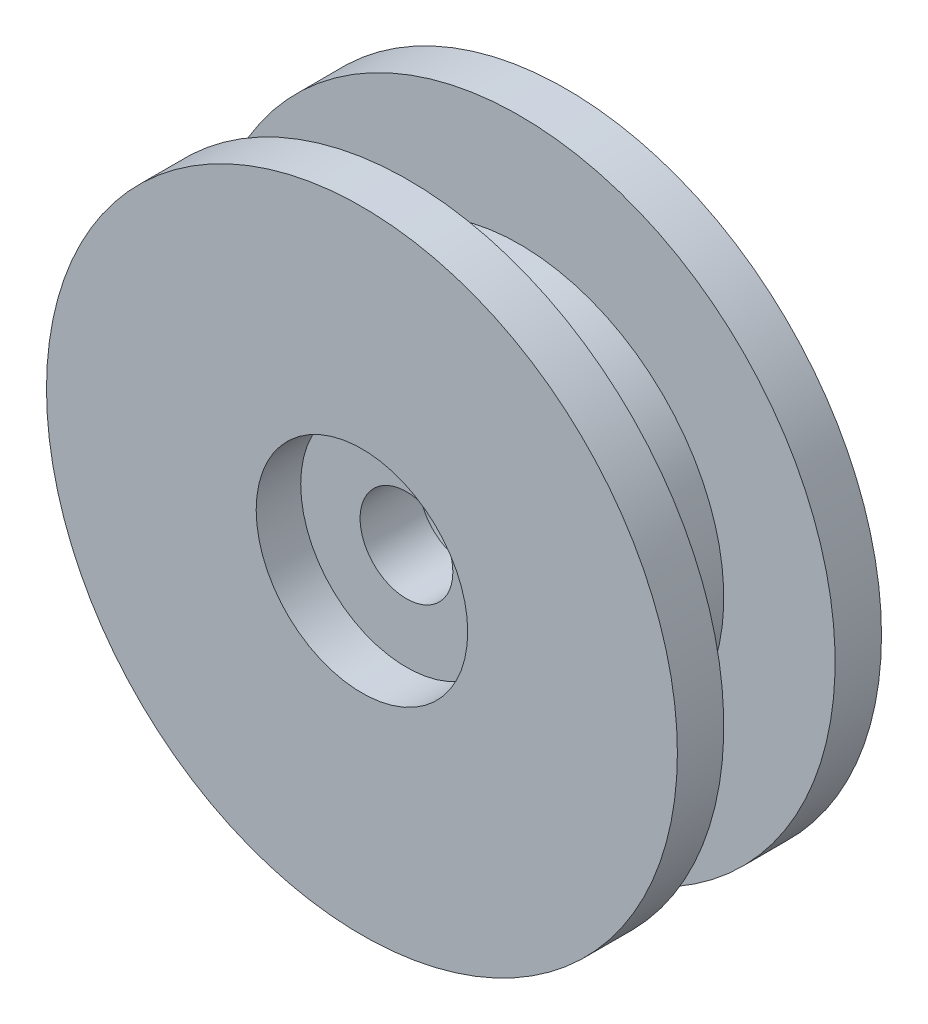
ISO-10303-21;
HEADER;
FILE_DESCRIPTION(('STEP AP214'),'2;1');
FILE_NAME('part.step','',(''),(''),'','','');
FILE_SCHEMA(('AUTOMOTIVE_DESIGN { 1 0 10303 214 1 1 1 1 }'));
ENDSEC;
DATA;
#1=APPLICATION_CONTEXT('core data for automotive mechanical design processes');
#2=APPLICATION_PROTOCOL_DEFINITION('international standard','automotive_design',2000,#1);
#3=PRODUCT_CONTEXT('',#1,'mechanical');
#4=PRODUCT('Part','Part','',(#3));
#5=PRODUCT_RELATED_PRODUCT_CATEGORY('part','',(#4));
#6=PRODUCT_DEFINITION_FORMATION('','',#4);
#7=PRODUCT_DEFINITION_CONTEXT('part definition',#1,'design');
#8=PRODUCT_DEFINITION('design','',#6,#7);
#9=PRODUCT_DEFINITION_SHAPE('','',#8);
#10=(LENGTH_UNIT() NAMED_UNIT(*) SI_UNIT(.MILLI.,.METRE.));
#11=(NAMED_UNIT(*) PLANE_ANGLE_UNIT() SI_UNIT($,.RADIAN.));
#12=(NAMED_UNIT(*) SI_UNIT($,.STERADIAN.) SOLID_ANGLE_UNIT());
#13=UNCERTAINTY_MEASURE_WITH_UNIT(LENGTH_MEASURE(1.E-05),#10,'distance_accuracy_value','');
#14=(GEOMETRIC_REPRESENTATION_CONTEXT(3) GLOBAL_UNCERTAINTY_ASSIGNED_CONTEXT((#13)) GLOBAL_UNIT_ASSIGNED_CONTEXT((#10,
#11,#12)) REPRESENTATION_CONTEXT('',''));
#15=CARTESIAN_POINT('',(0.,0.,0.));
#16=DIRECTION('',(0.,0.,1.));
#17=DIRECTION('',(1.,0.,0.));
#18=AXIS2_PLACEMENT_3D('',#15,#16,#17);
#19=CARTESIAN_POINT('',(0.,0.,0.));
#20=DIRECTION('',(0.,0.,1.));
#21=DIRECTION('',(1.,0.,0.));
#22=AXIS2_PLACEMENT_3D('',#19,#20,#21);
#23=CYLINDRICAL_SURFACE('',#22,1.25);
#24=CARTESIAN_POINT('',(0.,0.,4.3));
#25=DIRECTION('',(0.,0.,1.));
#26=DIRECTION('',(1.,0.,0.));
#27=AXIS2_PLACEMENT_3D('',#24,#25,#26);
#28=CIRCLE('',#27,1.25);
#29=CARTESIAN_POINT('',(1.25,0.,4.3));
#30=VERTEX_POINT('',#29);
#31=EDGE_CURVE('E51',#30,#30,#28,.T.);
#32=ORIENTED_EDGE('',*,*,#31,.T.);
#33=EDGE_LOOP('',(#32));
#34=FACE_BOUND('',#33,.T.);
#35=CARTESIAN_POINT('',(0.,0.,2.7));
#36=DIRECTION('',(0.,0.,-1.));
#37=DIRECTION('',(-1.,0.,0.));
#38=AXIS2_PLACEMENT_3D('',#35,#36,#37);
#39=CIRCLE('',#38,1.25);
#40=CARTESIAN_POINT('',(-1.25,0.,2.7));
#41=VERTEX_POINT('',#40);
#42=EDGE_CURVE('E38',#41,#41,#39,.F.);
#43=ORIENTED_EDGE('',*,*,#42,.F.);
#44=EDGE_LOOP('',(#43));
#45=FACE_BOUND('',#44,.T.);
#46=ADVANCED_FACE('F34',(#34,#45),#23,.F.);
#47=CARTESIAN_POINT('',(0.,0.,5.5));
#48=DIRECTION('',(0.,0.,-1.));
#49=DIRECTION('',(-1.,0.,0.));
#50=AXIS2_PLACEMENT_3D('',#47,#48,#49);
#51=CYLINDRICAL_SURFACE('',#50,8.5);
#52=CARTESIAN_POINT('',(0.,0.,4.25));
#53=DIRECTION('',(0.,0.,-1.));
#54=DIRECTION('',(-1.,0.,0.));
#55=AXIS2_PLACEMENT_3D('',#52,#53,#54);
#56=CIRCLE('',#55,8.5);
#57=CARTESIAN_POINT('',(-8.5,0.,4.25));
#58=VERTEX_POINT('',#57);
#59=EDGE_CURVE('E47',#58,#58,#56,.T.);
#60=ORIENTED_EDGE('',*,*,#59,.F.);
#61=EDGE_LOOP('',(#60));
#62=FACE_BOUND('',#61,.T.);
#63=CARTESIAN_POINT('',(0.,0.,5.5));
#64=DIRECTION('',(0.,0.,1.));
#65=DIRECTION('',(1.,0.,0.));
#66=AXIS2_PLACEMENT_3D('',#63,#64,#65);
#67=CIRCLE('',#66,8.5);
#68=CARTESIAN_POINT('',(8.5,0.,5.5));
#69=VERTEX_POINT('',#68);
#70=EDGE_CURVE('E10',#69,#69,#67,.T.);
#71=ORIENTED_EDGE('',*,*,#70,.F.);
#72=EDGE_LOOP('',(#71));
#73=FACE_BOUND('',#72,.T.);
#74=ADVANCED_FACE('F87',(#62,#73),#51,.T.);
#75=CARTESIAN_POINT('',(0.,0.,5.5));
#76=DIRECTION('',(0.,0.,1.));
#77=DIRECTION('',(1.,0.,0.));
#78=AXIS2_PLACEMENT_3D('',#75,#76,#77);
#79=PLANE('',#78);
#80=CARTESIAN_POINT('',(0.,0.,5.5));
#81=DIRECTION('',(0.,0.,1.));
#82=DIRECTION('',(1.,0.,0.));
#83=AXIS2_PLACEMENT_3D('',#80,#81,#82);
#84=CIRCLE('',#83,2.85);
#85=CARTESIAN_POINT('',(2.85,0.,5.5));
#86=VERTEX_POINT('',#85);
#87=EDGE_CURVE('E53',#86,#86,#84,.T.);
#88=ORIENTED_EDGE('',*,*,#87,.F.);
#89=EDGE_LOOP('',(#88));
#90=FACE_BOUND('',#89,.T.);
#91=ORIENTED_EDGE('',*,*,#70,.T.);
#92=EDGE_LOOP('',(#91));
#93=FACE_BOUND('',#92,.T.);
#94=ADVANCED_FACE('F90',(#90,#93),#79,.T.);
#95=CARTESIAN_POINT('',(0.,8.5,4.25));
#96=DIRECTION('',(0.,0.,1.));
#97=DIRECTION('',(1.,0.,0.));
#98=AXIS2_PLACEMENT_3D('',#95,#96,#97);
#99=PLANE('',#98);
#100=CARTESIAN_POINT('',(0.,0.,4.25));
#101=DIRECTION('',(0.,0.,-1.));
#102=DIRECTION('',(-1.,0.,0.));
#103=AXIS2_PLACEMENT_3D('',#100,#101,#102);
#104=CIRCLE('',#103,5.5);
#105=CARTESIAN_POINT('',(-5.5,0.,4.25));
#106=VERTEX_POINT('',#105);
#107=EDGE_CURVE('E78',#106,#106,#104,.T.);
#108=ORIENTED_EDGE('',*,*,#107,.F.);
#109=EDGE_LOOP('',(#108));
#110=FACE_BOUND('',#109,.T.);
#111=ORIENTED_EDGE('',*,*,#59,.T.);
#112=EDGE_LOOP('',(#111));
#113=FACE_BOUND('',#112,.T.);
#114=ADVANCED_FACE('F85',(#110,#113),#99,.F.);
#115=CARTESIAN_POINT('',(0.,0.,0.));
#116=DIRECTION('',(0.,0.,-1.));
#117=DIRECTION('',(-1.,0.,0.));
#118=AXIS2_PLACEMENT_3D('',#115,#116,#117);
#119=CYLINDRICAL_SURFACE('',#118,5.5);
#120=CARTESIAN_POINT('',(0.,0.,1.25));
#121=DIRECTION('',(0.,0.,-1.));
#122=DIRECTION('',(-1.,0.,0.));
#123=AXIS2_PLACEMENT_3D('',#120,#121,#122);
#124=CIRCLE('',#123,5.5);
#125=CARTESIAN_POINT('',(-5.5,0.,1.25));
#126=VERTEX_POINT('',#125);
#127=EDGE_CURVE('E76',#126,#126,#124,.T.);
#128=ORIENTED_EDGE('',*,*,#127,.F.);
#129=EDGE_LOOP('',(#128));
#130=FACE_BOUND('',#129,.T.);
#131=ORIENTED_EDGE('',*,*,#107,.T.);
#132=EDGE_LOOP('',(#131));
#133=FACE_BOUND('',#132,.T.);
#134=ADVANCED_FACE('F118',(#130,#133),#119,.T.);
#135=CARTESIAN_POINT('',(0.,5.5,1.25));
#136=DIRECTION('',(0.,0.,-1.));
#137=DIRECTION('',(-1.,0.,0.));
#138=AXIS2_PLACEMENT_3D('',#135,#136,#137);
#139=PLANE('',#138);
#140=CARTESIAN_POINT('',(0.,0.,1.25));
#141=DIRECTION('',(0.,0.,-1.));
#142=DIRECTION('',(-1.,0.,0.));
#143=AXIS2_PLACEMENT_3D('',#140,#141,#142);
#144=CIRCLE('',#143,8.5);
#145=CARTESIAN_POINT('',(-8.5,0.,1.25));
#146=VERTEX_POINT('',#145);
#147=EDGE_CURVE('E72',#146,#146,#144,.T.);
#148=ORIENTED_EDGE('',*,*,#147,.F.);
#149=EDGE_LOOP('',(#148));
#150=FACE_BOUND('',#149,.T.);
#151=ORIENTED_EDGE('',*,*,#127,.T.);
#152=EDGE_LOOP('',(#151));
#153=FACE_BOUND('',#152,.T.);
#154=ADVANCED_FACE('F109',(#150,#153),#139,.F.);
#155=CARTESIAN_POINT('',(0.,0.,0.));
#156=DIRECTION('',(0.,0.,1.));
#157=DIRECTION('',(1.,0.,0.));
#158=AXIS2_PLACEMENT_3D('',#155,#156,#157);
#159=PLANE('',#158);
#160=CARTESIAN_POINT('',(0.,0.,0.));
#161=DIRECTION('',(0.,0.,-1.));
#162=DIRECTION('',(-1.,0.,0.));
#163=AXIS2_PLACEMENT_3D('',#160,#161,#162);
#164=CIRCLE('',#163,2.32);
#165=CARTESIAN_POINT('',(-2.32,0.,0.));
#166=VERTEX_POINT('',#165);
#167=EDGE_CURVE('E64',#166,#166,#164,.T.);
#168=ORIENTED_EDGE('',*,*,#167,.F.);
#169=EDGE_LOOP('',(#168));
#170=FACE_BOUND('',#169,.T.);
#171=CARTESIAN_POINT('',(0.,0.,0.));
#172=DIRECTION('',(0.,0.,1.));
#173=DIRECTION('',(1.,0.,0.));
#174=AXIS2_PLACEMENT_3D('',#171,#172,#173);
#175=CIRCLE('',#174,8.5);
#176=CARTESIAN_POINT('',(8.5,0.,0.));
#177=VERTEX_POINT('',#176);
#178=EDGE_CURVE('E42',#177,#177,#175,.T.);
#179=ORIENTED_EDGE('',*,*,#178,.F.);
#180=EDGE_LOOP('',(#179));
#181=FACE_BOUND('',#180,.T.);
#182=ADVANCED_FACE('F100',(#170,#181),#159,.F.);
#183=ORIENTED_EDGE('',*,*,#147,.T.);
#184=EDGE_LOOP('',(#183));
#185=FACE_BOUND('',#184,.T.);
#186=ORIENTED_EDGE('',*,*,#178,.T.);
#187=EDGE_LOOP('',(#186));
#188=FACE_BOUND('',#187,.T.);
#189=ADVANCED_FACE('F36',(#185,#188),#51,.T.);
#190=CARTESIAN_POINT('',(0.,0.,4.3));
#191=DIRECTION('',(0.,0.,1.));
#192=DIRECTION('',(1.,0.,0.));
#193=AXIS2_PLACEMENT_3D('',#190,#191,#192);
#194=CYLINDRICAL_SURFACE('',#193,2.85);
#195=CARTESIAN_POINT('',(0.,0.,4.3));
#196=DIRECTION('',(0.,0.,1.));
#197=DIRECTION('',(1.,0.,0.));
#198=AXIS2_PLACEMENT_3D('',#195,#196,#197);
#199=CIRCLE('',#198,2.85);
#200=CARTESIAN_POINT('',(2.85,0.,4.3));
#201=VERTEX_POINT('',#200);
#202=EDGE_CURVE('E57',#201,#201,#199,.T.);
#203=ORIENTED_EDGE('',*,*,#202,.F.);
#204=EDGE_LOOP('',(#203));
#205=FACE_BOUND('',#204,.T.);
#206=ORIENTED_EDGE('',*,*,#87,.T.);
#207=EDGE_LOOP('',(#206));
#208=FACE_BOUND('',#207,.T.);
#209=ADVANCED_FACE('F99',(#205,#208),#194,.F.);
#210=CARTESIAN_POINT('',(0.,0.,4.3));
#211=DIRECTION('',(0.,0.,1.));
#212=DIRECTION('',(1.,0.,0.));
#213=AXIS2_PLACEMENT_3D('',#210,#211,#212);
#214=PLANE('',#213);
#215=ORIENTED_EDGE('',*,*,#31,.F.);
#216=EDGE_LOOP('',(#215));
#217=FACE_BOUND('',#216,.T.);
#218=ORIENTED_EDGE('',*,*,#202,.T.);
#219=EDGE_LOOP('',(#218));
#220=FACE_BOUND('',#219,.T.);
#221=ADVANCED_FACE('F106',(#217,#220),#214,.T.);
#222=CARTESIAN_POINT('',(0.,0.,2.7));
#223=DIRECTION('',(0.,0.,-1.));
#224=DIRECTION('',(-1.,0.,0.));
#225=AXIS2_PLACEMENT_3D('',#222,#223,#224);
#226=PLANE('',#225);
#227=CARTESIAN_POINT('',(0.,0.,2.7));
#228=DIRECTION('',(0.,0.,-1.));
#229=DIRECTION('',(-1.,0.,0.));
#230=AXIS2_PLACEMENT_3D('',#227,#228,#229);
#231=CIRCLE('',#230,2.32);
#232=CARTESIAN_POINT('',(-2.32,0.,2.7));
#233=VERTEX_POINT('',#232);
#234=EDGE_CURVE('E60',#233,#233,#231,.T.);
#235=ORIENTED_EDGE('',*,*,#234,.T.);
#236=EDGE_LOOP('',(#235));
#237=FACE_BOUND('',#236,.T.);
#238=ORIENTED_EDGE('',*,*,#42,.T.);
#239=EDGE_LOOP('',(#238));
#240=FACE_BOUND('',#239,.T.);
#241=ADVANCED_FACE('F131',(#237,#240),#226,.T.);
#242=CARTESIAN_POINT('',(0.,0.,2.7));
#243=DIRECTION('',(0.,0.,-1.));
#244=DIRECTION('',(-1.,0.,0.));
#245=AXIS2_PLACEMENT_3D('',#242,#243,#244);
#246=CYLINDRICAL_SURFACE('',#245,2.32);
#247=CARTESIAN_POINT('',(-2.32,0.,2.7));
#248=CARTESIAN_POINT('',(-2.32,0.,2.671875));
#249=CARTESIAN_POINT('',(-2.32,0.,2.64375));
#250=CARTESIAN_POINT('',(-2.32,0.,2.5875));
#251=CARTESIAN_POINT('',(-2.32,0.,2.559375));
#252=CARTESIAN_POINT('',(-2.32,0.,2.503125));
#253=CARTESIAN_POINT('',(-2.32,0.,2.475));
#254=CARTESIAN_POINT('',(-2.32,0.,2.41875));
#255=CARTESIAN_POINT('',(-2.32,0.,2.390625));
#256=CARTESIAN_POINT('',(-2.32,0.,2.334375));
#257=CARTESIAN_POINT('',(-2.32,0.,2.30625));
#258=CARTESIAN_POINT('',(-2.32,0.,2.25));
#259=CARTESIAN_POINT('',(-2.32,0.,2.221875));
#260=CARTESIAN_POINT('',(-2.32,0.,2.165625));
#261=CARTESIAN_POINT('',(-2.32,0.,2.1375));
#262=CARTESIAN_POINT('',(-2.32,0.,2.08125));
#263=CARTESIAN_POINT('',(-2.32,0.,2.053125));
#264=CARTESIAN_POINT('',(-2.32,0.,1.996875));
#265=CARTESIAN_POINT('',(-2.32,0.,1.96875));
#266=CARTESIAN_POINT('',(-2.32,0.,1.9125));
#267=CARTESIAN_POINT('',(-2.32,0.,1.884375));
#268=CARTESIAN_POINT('',(-2.32,0.,1.828125));
#269=CARTESIAN_POINT('',(-2.32,0.,1.8));
#270=CARTESIAN_POINT('',(-2.32,0.,1.74375));
#271=CARTESIAN_POINT('',(-2.32,0.,1.715625));
#272=CARTESIAN_POINT('',(-2.32,0.,1.659375));
#273=CARTESIAN_POINT('',(-2.32,0.,1.63125));
#274=CARTESIAN_POINT('',(-2.32,0.,1.575));
#275=CARTESIAN_POINT('',(-2.32,0.,1.546875));
#276=CARTESIAN_POINT('',(-2.32,0.,1.490625));
#277=CARTESIAN_POINT('',(-2.32,0.,1.4625));
#278=CARTESIAN_POINT('',(-2.32,0.,1.40625));
#279=CARTESIAN_POINT('',(-2.32,0.,1.378125));
#280=CARTESIAN_POINT('',(-2.32,0.,1.321875));
#281=CARTESIAN_POINT('',(-2.32,0.,1.29375));
#282=CARTESIAN_POINT('',(-2.32,0.,1.2375));
#283=CARTESIAN_POINT('',(-2.32,0.,1.209375));
#284=CARTESIAN_POINT('',(-2.32,0.,1.153125));
#285=CARTESIAN_POINT('',(-2.32,0.,1.125));
#286=CARTESIAN_POINT('',(-2.32,0.,1.06875));
#287=CARTESIAN_POINT('',(-2.32,0.,1.040625));
#288=CARTESIAN_POINT('',(-2.32,0.,0.984375));
#289=CARTESIAN_POINT('',(-2.32,0.,0.95625));
#290=CARTESIAN_POINT('',(-2.32,0.,0.9));
#291=CARTESIAN_POINT('',(-2.32,0.,0.871875));
#292=CARTESIAN_POINT('',(-2.32,0.,0.815625));
#293=CARTESIAN_POINT('',(-2.32,0.,0.7875));
#294=CARTESIAN_POINT('',(-2.32,0.,0.73125));
#295=CARTESIAN_POINT('',(-2.32,0.,0.703125000000001));
#296=CARTESIAN_POINT('',(-2.32,0.,0.646875000000001));
#297=CARTESIAN_POINT('',(-2.32,0.,0.61875));
#298=CARTESIAN_POINT('',(-2.32,0.,0.5625));
#299=CARTESIAN_POINT('',(-2.32,0.,0.534375000000001));
#300=CARTESIAN_POINT('',(-2.32,0.,0.478125000000001));
#301=CARTESIAN_POINT('',(-2.32,0.,0.45));
#302=CARTESIAN_POINT('',(-2.32,0.,0.39375));
#303=CARTESIAN_POINT('',(-2.32,0.,0.365625));
#304=CARTESIAN_POINT('',(-2.32,0.,0.309375));
#305=CARTESIAN_POINT('',(-2.32,0.,0.28125));
#306=CARTESIAN_POINT('',(-2.32,0.,0.225));
#307=CARTESIAN_POINT('',(-2.32,0.,0.196875));
#308=CARTESIAN_POINT('',(-2.32,0.,0.140625));
#309=CARTESIAN_POINT('',(-2.32,0.,0.1125));
#310=CARTESIAN_POINT('',(-2.32,0.,0.0562500000000003));
#311=CARTESIAN_POINT('',(-2.32,0.,0.0281250000000003));
#312=CARTESIAN_POINT('',(-2.32,0.,0.));
#313=B_SPLINE_CURVE_WITH_KNOTS('',3,(#247,#248,#249,#250,#251,#252,#253,#254,#255,#256,#257,
#258,#259,#260,#261,#262,#263,#264,#265,#266,#267,#268,#269,#270,#271,#272,#273,#274,#275,#276,
#277,#278,#279,#280,#281,#282,#283,#284,#285,#286,#287,#288,#289,#290,#291,#292,#293,#294,#295,
#296,#297,#298,#299,#300,#301,#302,#303,#304,#305,#306,#307,#308,#309,#310,#311,#312),
.UNSPECIFIED.,.F.,.F.,(4,2,2,2,2,2,2,2,2,2,2,2,2,2,2,2,2,2,2,2,2,2,2,2,2,2,2,2,2,2,2,2,4),(0.,
0.0843750000000003,0.16875,0.253125,0.3375,0.421875,0.50625,0.590625,0.675,0.759375,0.84375,
0.928125,1.0125,1.096875,1.18125,1.265625,1.35,1.434375,1.51875,1.603125,1.6875,1.771875,
1.85625,1.940625,2.025,2.109375,2.19375,2.278125,2.3625,2.446875,2.53125,2.615625,2.7),.UNSPECIFIED.);
#314=EDGE_CURVE('BSEAM134',#233,#166,#313,.T.);
#315=ORIENTED_EDGE('',*,*,#234,.F.);
#316=ORIENTED_EDGE('',*,*,#167,.T.);
#317=ORIENTED_EDGE('',*,*,#314,.T.);
#318=ORIENTED_EDGE('',*,*,#314,.F.);
#319=EDGE_LOOP('',(#315,#317,#316,#318));
#320=FACE_BOUND('',#319,.T.);
#321=ADVANCED_FACE('F134',(#320),#246,.F.);
#322=CLOSED_SHELL('',(#46,#74,#94,#114,#134,#154,#182,#189,#209,#221,#241,#321));
#323=MANIFOLD_SOLID_BREP('B2',#322);
#324=ADVANCED_BREP_SHAPE_REPRESENTATION('',(#18,#323),#14);
#325=SHAPE_DEFINITION_REPRESENTATION(#9,#324);
ENDSEC;
END-ISO-10303-21;
